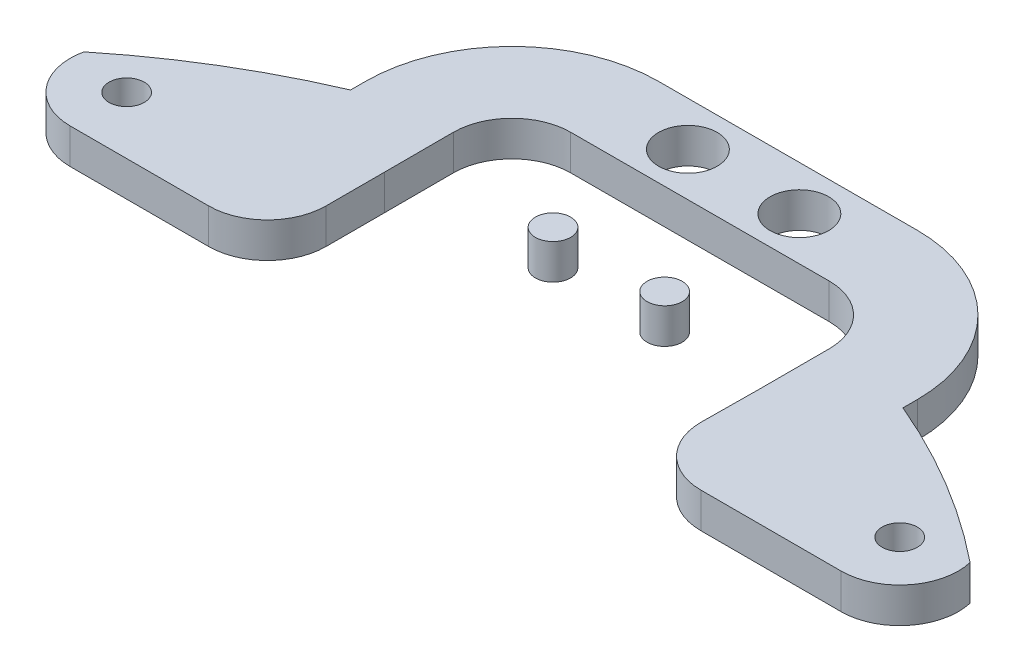
ISO-10303-21;
HEADER;
FILE_DESCRIPTION(('STEP AP214'),'2;1');
FILE_NAME('part.step','',(''),(''),'','','');
FILE_SCHEMA(('AUTOMOTIVE_DESIGN { 1 0 10303 214 1 1 1 1 }'));
ENDSEC;
DATA;
#1=APPLICATION_CONTEXT('core data for automotive mechanical design processes');
#2=APPLICATION_PROTOCOL_DEFINITION('international standard','automotive_design',2000,#1);
#3=PRODUCT_CONTEXT('',#1,'mechanical');
#4=PRODUCT('Part','Part','',(#3));
#5=PRODUCT_RELATED_PRODUCT_CATEGORY('part','',(#4));
#6=PRODUCT_DEFINITION_FORMATION('','',#4);
#7=PRODUCT_DEFINITION_CONTEXT('part definition',#1,'design');
#8=PRODUCT_DEFINITION('design','',#6,#7);
#9=PRODUCT_DEFINITION_SHAPE('','',#8);
#10=(LENGTH_UNIT() NAMED_UNIT(*) SI_UNIT(.MILLI.,.METRE.));
#11=(NAMED_UNIT(*) PLANE_ANGLE_UNIT() SI_UNIT($,.RADIAN.));
#12=(NAMED_UNIT(*) SI_UNIT($,.STERADIAN.) SOLID_ANGLE_UNIT());
#13=UNCERTAINTY_MEASURE_WITH_UNIT(LENGTH_MEASURE(1.E-05),#10,'distance_accuracy_value','');
#14=(GEOMETRIC_REPRESENTATION_CONTEXT(3) GLOBAL_UNCERTAINTY_ASSIGNED_CONTEXT((#13)) GLOBAL_UNIT_ASSIGNED_CONTEXT((#10,
#11,#12)) REPRESENTATION_CONTEXT('',''));
#15=CARTESIAN_POINT('',(0.,0.,0.));
#16=DIRECTION('',(0.,0.,1.));
#17=DIRECTION('',(1.,0.,0.));
#18=AXIS2_PLACEMENT_3D('',#15,#16,#17);
#19=CARTESIAN_POINT('',(66.2482415945255,3.,-8.11771555190945));
#20=DIRECTION('',(0.,-1.,0.));
#21=DIRECTION('',(0.,0.,-1.));
#22=AXIS2_PLACEMENT_3D('',#19,#20,#21);
#23=CYLINDRICAL_SURFACE('',#22,1.5);
#24=CARTESIAN_POINT('',(66.2482415945255,3.,-8.11771555190945));
#25=DIRECTION('',(0.,1.,0.));
#26=DIRECTION('',(0.,0.,1.));
#27=AXIS2_PLACEMENT_3D('',#24,#25,#26);
#28=CIRCLE('',#27,1.5);
#29=CARTESIAN_POINT('',(66.2482415945255,3.,-6.61771555190945));
#30=VERTEX_POINT('',#29);
#31=EDGE_CURVE('E11',#30,#30,#28,.T.);
#32=ORIENTED_EDGE('',*,*,#31,.F.);
#33=EDGE_LOOP('',(#32));
#34=FACE_BOUND('',#33,.T.);
#35=CARTESIAN_POINT('',(66.2482415945255,0.,-8.11771555190945));
#36=DIRECTION('',(0.,1.,0.));
#37=DIRECTION('',(0.,0.,1.));
#38=AXIS2_PLACEMENT_3D('',#35,#36,#37);
#39=CIRCLE('',#38,1.5);
#40=CARTESIAN_POINT('',(66.2482415945255,0.,-6.61771555190945));
#41=VERTEX_POINT('',#40);
#42=EDGE_CURVE('E43',#41,#41,#39,.T.);
#43=ORIENTED_EDGE('',*,*,#42,.T.);
#44=EDGE_LOOP('',(#43));
#45=FACE_BOUND('',#44,.T.);
#46=ADVANCED_FACE('F40',(#34,#45),#23,.T.);
#47=CARTESIAN_POINT('',(66.2482415945255,3.,-8.11771555190945));
#48=DIRECTION('',(0.,1.,0.));
#49=DIRECTION('',(0.,0.,1.));
#50=AXIS2_PLACEMENT_3D('',#47,#48,#49);
#51=PLANE('',#50);
#52=ORIENTED_EDGE('',*,*,#31,.T.);
#53=EDGE_LOOP('',(#52));
#54=FACE_BOUND('',#53,.T.);
#55=ADVANCED_FACE('F55',(#54),#51,.T.);
#56=CARTESIAN_POINT('',(66.2482415945255,0.,-8.11771555190945));
#57=DIRECTION('',(0.,1.,0.));
#58=DIRECTION('',(0.,0.,1.));
#59=AXIS2_PLACEMENT_3D('',#56,#57,#58);
#60=PLANE('',#59);
#61=ORIENTED_EDGE('',*,*,#42,.F.);
#62=EDGE_LOOP('',(#61));
#63=FACE_BOUND('',#62,.T.);
#64=ADVANCED_FACE('F53',(#63),#60,.F.);
#65=CLOSED_SHELL('',(#46,#55,#64));
#66=MANIFOLD_SOLID_BREP('B2',#65);
#67=CARTESIAN_POINT('',(56.7482546611768,3.,-8.10195908641783));
#68=DIRECTION('',(0.,-1.,0.));
#69=DIRECTION('',(0.,0.,-1.));
#70=AXIS2_PLACEMENT_3D('',#67,#68,#69);
#71=CYLINDRICAL_SURFACE('',#70,1.5);
#72=CARTESIAN_POINT('',(56.7482546611768,3.,-8.10195908641783));
#73=DIRECTION('',(0.,1.,0.));
#74=DIRECTION('',(0.,0.,1.));
#75=AXIS2_PLACEMENT_3D('',#72,#73,#74);
#76=CIRCLE('',#75,1.5);
#77=CARTESIAN_POINT('',(56.7482546611768,3.,-6.60195908641783));
#78=VERTEX_POINT('',#77);
#79=EDGE_CURVE('E39',#78,#78,#76,.T.);
#80=ORIENTED_EDGE('',*,*,#79,.F.);
#81=EDGE_LOOP('',(#80));
#82=FACE_BOUND('',#81,.T.);
#83=CARTESIAN_POINT('',(56.7482546611768,0.,-8.10195908641783));
#84=DIRECTION('',(0.,1.,0.));
#85=DIRECTION('',(0.,0.,1.));
#86=AXIS2_PLACEMENT_3D('',#83,#84,#85);
#87=CIRCLE('',#86,1.5);
#88=CARTESIAN_POINT('',(56.7482546611768,0.,-6.60195908641783));
#89=VERTEX_POINT('',#88);
#90=EDGE_CURVE('E93',#89,#89,#87,.T.);
#91=ORIENTED_EDGE('',*,*,#90,.T.);
#92=EDGE_LOOP('',(#91));
#93=FACE_BOUND('',#92,.T.);
#94=ADVANCED_FACE('F90',(#82,#93),#71,.T.);
#95=CARTESIAN_POINT('',(56.7482546611768,3.,-8.10195908641783));
#96=DIRECTION('',(0.,1.,0.));
#97=DIRECTION('',(0.,0.,1.));
#98=AXIS2_PLACEMENT_3D('',#95,#96,#97);
#99=PLANE('',#98);
#100=ORIENTED_EDGE('',*,*,#79,.T.);
#101=EDGE_LOOP('',(#100));
#102=FACE_BOUND('',#101,.T.);
#103=ADVANCED_FACE('F105',(#102),#99,.T.);
#104=CARTESIAN_POINT('',(56.7482546611768,0.,-8.10195908641783));
#105=DIRECTION('',(0.,1.,0.));
#106=DIRECTION('',(0.,0.,1.));
#107=AXIS2_PLACEMENT_3D('',#104,#105,#106);
#108=PLANE('',#107);
#109=ORIENTED_EDGE('',*,*,#90,.F.);
#110=EDGE_LOOP('',(#109));
#111=FACE_BOUND('',#110,.T.);
#112=ADVANCED_FACE('F103',(#111),#108,.F.);
#113=CLOSED_SHELL('',(#94,#103,#112));
#114=MANIFOLD_SOLID_BREP('B6',#113);
#115=CARTESIAN_POINT('',(94.4017441605242,3.,-5.09314812546791E-12));
#116=DIRECTION('',(0.,1.,0.));
#117=DIRECTION('',(0.,0.,1.));
#118=AXIS2_PLACEMENT_3D('',#115,#116,#117);
#119=PLANE('',#118);
#120=CARTESIAN_POINT('',(28.6197942043737,3.,0.109104468424916));
#121=DIRECTION('',(0.,1.,0.));
#122=DIRECTION('',(0.,0.,1.));
#123=AXIS2_PLACEMENT_3D('',#120,#121,#122);
#124=CIRCLE('',#123,1.5);
#125=CARTESIAN_POINT('',(28.6197942043737,3.,1.60910446842491));
#126=VERTEX_POINT('',#125);
#127=EDGE_CURVE('E493',#126,#126,#124,.T.);
#128=ORIENTED_EDGE('',*,*,#127,.F.);
#129=EDGE_LOOP('',(#128));
#130=FACE_BOUND('',#129,.T.);
#131=CARTESIAN_POINT('',(56.7482546611768,3.,-19.5997805691747));
#132=DIRECTION('',(0.,1.,0.));
#133=DIRECTION('',(0.,0.,1.));
#134=AXIS2_PLACEMENT_3D('',#131,#132,#133);
#135=CIRCLE('',#134,2.5);
#136=CARTESIAN_POINT('',(56.7482546611768,3.,-17.0997805691747));
#137=VERTEX_POINT('',#136);
#138=EDGE_CURVE('E304',#137,#137,#135,.T.);
#139=ORIENTED_EDGE('',*,*,#138,.F.);
#140=EDGE_LOOP('',(#139));
#141=FACE_BOUND('',#140,.T.);
#142=CARTESIAN_POINT('',(94.4017441605242,3.,-5.09314812546791E-12));
#143=DIRECTION('',(0.,1.,0.));
#144=DIRECTION('',(0.,0.,1.));
#145=AXIS2_PLACEMENT_3D('',#142,#143,#144);
#146=CIRCLE('',#145,5.00000000004039);
#147=CARTESIAN_POINT('',(94.4017441604865,3.,5.00000000003529));
#148=VERTEX_POINT('',#147);
#149=CARTESIAN_POINT('',(99.2740853669501,3.,-1.12262690533402));
#150=VERTEX_POINT('',#149);
#151=EDGE_CURVE('E339',#148,#150,#146,.T.);
#152=ORIENTED_EDGE('',*,*,#151,.T.);
#153=CARTESIAN_POINT('',(61.5872714696782,3.,45.5646739191136));
#154=DIRECTION('',(0.,1.,0.));
#155=DIRECTION('',(0.,0.,1.));
#156=AXIS2_PLACEMENT_3D('',#153,#154,#155);
#157=CIRCLE('',#156,60.0000000000006);
#158=CARTESIAN_POINT('',(84.9939370937053,3.,-9.68139385376106));
#159=VERTEX_POINT('',#158);
#160=EDGE_CURVE('E227',#150,#159,#157,.T.);
#161=ORIENTED_EDGE('',*,*,#160,.T.);
#162=DIRECTION('',(-0.000258123030673322,0.,-0.99999996668625));
#163=VECTOR('',#162,1.);
#164=CARTESIAN_POINT('',(84.9939370937054,3.,-9.68139385376104));
#165=LINE('',#164,#163);
#166=CARTESIAN_POINT('',(84.9936169760075,3.,-10.9215686894143));
#167=VERTEX_POINT('',#166);
#168=EDGE_CURVE('E390',#159,#167,#165,.T.);
#169=ORIENTED_EDGE('',*,*,#168,.T.);
#170=CARTESIAN_POINT('',(72.4936341689699,3.,-10.9008364979206));
#171=DIRECTION('',(0.,1.,0.));
#172=DIRECTION('',(0.,0.,1.));
#173=AXIS2_PLACEMENT_3D('',#170,#171,#172);
#174=CIRCLE('',#173,12.5);
#175=CARTESIAN_POINT('',(72.4729019775336,3.,-23.4008193049583));
#176=VERTEX_POINT('',#175);
#177=EDGE_CURVE('E409',#167,#176,#174,.T.);
#178=ORIENTED_EDGE('',*,*,#177,.T.);
#179=DIRECTION('',(-0.999998624563017,0.,0.0016585753149059));
#180=VECTOR('',#179,1.);
#181=CARTESIAN_POINT('',(72.4729019775336,3.,-23.4008193049583));
#182=LINE('',#181,#180);
#183=CARTESIAN_POINT('',(50.4729322371472,3.,-23.3643306480304));
#184=VERTEX_POINT('',#183);
#185=EDGE_CURVE('E406',#176,#184,#182,.T.);
#186=ORIENTED_EDGE('',*,*,#185,.T.);
#187=CARTESIAN_POINT('',(50.4936644285836,3.,-10.8643478409927));
#188=DIRECTION('',(0.,1.,0.));
#189=DIRECTION('',(0.,0.,1.));
#190=AXIS2_PLACEMENT_3D('',#187,#188,#189);
#191=CIRCLE('',#190,12.5);
#192=CARTESIAN_POINT('',(37.9936816215459,3.,-10.8436156495564));
#193=VERTEX_POINT('',#192);
#194=EDGE_CURVE('E408',#184,#193,#191,.T.);
#195=ORIENTED_EDGE('',*,*,#194,.T.);
#196=DIRECTION('',(0.000239441116848412,0.,0.999999971333975));
#197=VECTOR('',#196,1.);
#198=CARTESIAN_POINT('',(37.9936816215459,3.,-10.8436156495564));
#199=LINE('',#198,#197);
#200=CARTESIAN_POINT('',(37.9939789270336,3.,-9.60195138094567));
#201=VERTEX_POINT('',#200);
#202=EDGE_CURVE('E411',#193,#201,#199,.T.);
#203=ORIENTED_EDGE('',*,*,#202,.T.);
#204=CARTESIAN_POINT('',(61.5872714696782,3.,45.5646739191136));
#205=DIRECTION('',(0.,1.,0.));
#206=DIRECTION('',(0.,0.,1.));
#207=AXIS2_PLACEMENT_3D('',#204,#205,#206);
#208=CIRCLE('',#207,60.);
#209=CARTESIAN_POINT('',(23.8137806106933,3.,-1.05252664383504));
#210=VERTEX_POINT('',#209);
#211=EDGE_CURVE('E417',#201,#210,#208,.T.);
#212=ORIENTED_EDGE('',*,*,#211,.T.);
#213=CARTESIAN_POINT('',(28.7017441604768,3.,0.));
#214=DIRECTION('',(0.,1.,0.));
#215=DIRECTION('',(0.,0.,1.));
#216=AXIS2_PLACEMENT_3D('',#213,#214,#215);
#217=CIRCLE('',#216,4.99999999999993);
#218=CARTESIAN_POINT('',(28.7017441604768,3.,4.99999999999994));
#219=VERTEX_POINT('',#218);
#220=EDGE_CURVE('E419',#210,#219,#217,.T.);
#221=ORIENTED_EDGE('',*,*,#220,.T.);
#222=DIRECTION('',(1.,0.,5.37101593738761E-13));
#223=VECTOR('',#222,1.);
#224=CARTESIAN_POINT('',(40.5033840273318,3.,5.00000000000635));
#225=LINE('',#224,#223);
#226=CARTESIAN_POINT('',(40.5033840273318,3.,5.00000000000635));
#227=VERTEX_POINT('',#226);
#228=EDGE_CURVE('E421',#219,#227,#225,.T.);
#229=ORIENTED_EDGE('',*,*,#228,.T.);
#230=CARTESIAN_POINT('',(40.5033840273344,3.,6.34648583686501E-12));
#231=DIRECTION('',(0.,1.,0.));
#232=DIRECTION('',(0.,0.,-1.));
#233=AXIS2_PLACEMENT_3D('',#230,#231,#232);
#234=CIRCLE('',#233,5.);
#235=CARTESIAN_POINT('',(45.5033840273344,3.,6.34617967516522E-12));
#236=VERTEX_POINT('',#235);
#237=EDGE_CURVE('E423',#227,#236,#234,.T.);
#238=ORIENTED_EDGE('',*,*,#237,.T.);
#239=DIRECTION('',(0.,0.,-1.));
#240=VECTOR('',#239,1.);
#241=CARTESIAN_POINT('',(45.5033840273344,3.,-5.00000000000017));
#242=LINE('',#241,#240);
#243=CARTESIAN_POINT('',(45.5033840273344,3.,-5.00000000000017));
#244=VERTEX_POINT('',#243);
#245=EDGE_CURVE('E425',#236,#244,#242,.T.);
#246=ORIENTED_EDGE('',*,*,#245,.T.);
#247=DIRECTION('',(-0.00165857531490633,0.,-0.999998624563016));
#248=VECTOR('',#247,1.);
#249=CARTESIAN_POINT('',(45.4936713057685,3.,-10.8560549644182));
#250=LINE('',#249,#248);
#251=CARTESIAN_POINT('',(45.4936713057685,3.,-10.8560549644182));
#252=VERTEX_POINT('',#251);
#253=EDGE_CURVE('E427',#244,#252,#250,.T.);
#254=ORIENTED_EDGE('',*,*,#253,.T.);
#255=CARTESIAN_POINT('',(50.4936644285836,3.,-10.8643478409927));
#256=DIRECTION('',(0.,-1.,0.));
#257=DIRECTION('',(0.,0.,1.));
#258=AXIS2_PLACEMENT_3D('',#255,#256,#257);
#259=CIRCLE('',#258,5.);
#260=CARTESIAN_POINT('',(50.485371552009,3.,-15.8643409638078));
#261=VERTEX_POINT('',#260);
#262=EDGE_CURVE('E429',#252,#261,#259,.T.);
#263=ORIENTED_EDGE('',*,*,#262,.T.);
#264=DIRECTION('',(0.999998624563017,0.,-0.00165857531490606));
#265=VECTOR('',#264,1.);
#266=CARTESIAN_POINT('',(72.4853412923954,3.,-15.9008296207357));
#267=LINE('',#266,#265);
#268=CARTESIAN_POINT('',(72.4853412923954,3.,-15.9008296207357));
#269=VERTEX_POINT('',#268);
#270=EDGE_CURVE('E431',#261,#269,#267,.T.);
#271=ORIENTED_EDGE('',*,*,#270,.T.);
#272=CARTESIAN_POINT('',(72.4936341689699,3.,-10.9008364979206));
#273=DIRECTION('',(0.,-1.,0.));
#274=DIRECTION('',(0.,0.,1.));
#275=AXIS2_PLACEMENT_3D('',#272,#273,#274);
#276=CIRCLE('',#275,4.99999999999999);
#277=CARTESIAN_POINT('',(77.493627291785,3.,-10.9091293744952));
#278=VERTEX_POINT('',#277);
#279=EDGE_CURVE('E433',#269,#278,#276,.T.);
#280=ORIENTED_EDGE('',*,*,#279,.T.);
#281=DIRECTION('',(0.000255174911125051,0.,0.999999967442882));
#282=VECTOR('',#281,1.);
#283=CARTESIAN_POINT('',(77.4951351533971,3.,-4.99999999999046));
#284=LINE('',#283,#282);
#285=CARTESIAN_POINT('',(77.4951351533971,3.,-4.99999999999046));
#286=VERTEX_POINT('',#285);
#287=EDGE_CURVE('E282',#278,#286,#284,.T.);
#288=ORIENTED_EDGE('',*,*,#287,.T.);
#289=DIRECTION('',(-0.00912026694199644,0.,0.999958409500569));
#290=VECTOR('',#289,1.);
#291=CARTESIAN_POINT('',(77.4951351533971,3.,-4.99999999999046));
#292=LINE('',#291,#290);
#293=CARTESIAN_POINT('',(77.4499478356693,3.,-0.045601334681104));
#294=VERTEX_POINT('',#293);
#295=EDGE_CURVE('E276',#286,#294,#292,.T.);
#296=ORIENTED_EDGE('',*,*,#295,.T.);
#297=CARTESIAN_POINT('',(82.4497398831721,3.,2.88744798835198E-11));
#298=DIRECTION('',(0.,1.,0.));
#299=DIRECTION('',(0.,0.,-1.));
#300=AXIS2_PLACEMENT_3D('',#297,#298,#299);
#301=CIRCLE('',#300,5.);
#302=CARTESIAN_POINT('',(82.4497398831694,3.,5.00000000002888));
#303=VERTEX_POINT('',#302);
#304=EDGE_CURVE('E280',#294,#303,#301,.T.);
#305=ORIENTED_EDGE('',*,*,#304,.T.);
#306=DIRECTION('',(1.,0.,5.3694839379833E-13));
#307=VECTOR('',#306,1.);
#308=CARTESIAN_POINT('',(94.4017441604865,3.,5.00000000003529));
#309=LINE('',#308,#307);
#310=EDGE_CURVE('E148',#303,#148,#309,.T.);
#311=ORIENTED_EDGE('',*,*,#310,.T.);
#312=EDGE_LOOP('',(#152,#161,#169,#178,#186,#195,#203,#212,#221,#229,#238,#246,#254,#263,#271,
#280,#288,#296,#305,#311));
#313=FACE_BOUND('',#312,.T.);
#314=CARTESIAN_POINT('',(66.2482415945255,3.,-19.5997805691747));
#315=DIRECTION('',(0.,1.,0.));
#316=DIRECTION('',(0.,0.,1.));
#317=AXIS2_PLACEMENT_3D('',#314,#315,#316);
#318=CIRCLE('',#317,2.50000000000001);
#319=CARTESIAN_POINT('',(66.2482415945255,3.,-17.0997805691747));
#320=VERTEX_POINT('',#319);
#321=EDGE_CURVE('E499',#320,#320,#318,.T.);
#322=ORIENTED_EDGE('',*,*,#321,.F.);
#323=EDGE_LOOP('',(#322));
#324=FACE_BOUND('',#323,.T.);
#325=CARTESIAN_POINT('',(94.4017441605242,3.,-5.09314812546791E-12));
#326=DIRECTION('',(0.,1.,0.));
#327=DIRECTION('',(0.,0.,1.));
#328=AXIS2_PLACEMENT_3D('',#325,#326,#327);
#329=CIRCLE('',#328,1.5);
#330=CARTESIAN_POINT('',(94.4017441605242,3.,1.4999999999949));
#331=VERTEX_POINT('',#330);
#332=EDGE_CURVE('E484',#331,#331,#329,.T.);
#333=ORIENTED_EDGE('',*,*,#332,.F.);
#334=EDGE_LOOP('',(#333));
#335=FACE_BOUND('',#334,.T.);
#336=ADVANCED_FACE('F131',(#130,#141,#313,#324,#335),#119,.T.);
#337=CARTESIAN_POINT('',(94.4017441605242,0.,-5.09314812546791E-12));
#338=DIRECTION('',(0.,1.,0.));
#339=DIRECTION('',(0.,0.,1.));
#340=AXIS2_PLACEMENT_3D('',#337,#338,#339);
#341=PLANE('',#340);
#342=CARTESIAN_POINT('',(94.4017441605242,0.,-5.09314812546791E-12));
#343=DIRECTION('',(0.,1.,0.));
#344=DIRECTION('',(0.,0.,1.));
#345=AXIS2_PLACEMENT_3D('',#342,#343,#344);
#346=CIRCLE('',#345,5.00000000004039);
#347=CARTESIAN_POINT('',(94.4017441604865,0.,5.00000000003529));
#348=VERTEX_POINT('',#347);
#349=CARTESIAN_POINT('',(99.2740853669501,0.,-1.12262690533402));
#350=VERTEX_POINT('',#349);
#351=EDGE_CURVE('E300',#348,#350,#346,.T.);
#352=ORIENTED_EDGE('',*,*,#351,.F.);
#353=DIRECTION('',(1.,0.,5.3694839379833E-13));
#354=VECTOR('',#353,1.);
#355=CARTESIAN_POINT('',(94.4017441604865,0.,5.00000000003529));
#356=LINE('',#355,#354);
#357=CARTESIAN_POINT('',(82.4497398831694,0.,5.00000000002888));
#358=VERTEX_POINT('',#357);
#359=EDGE_CURVE('E219',#358,#348,#356,.T.);
#360=ORIENTED_EDGE('',*,*,#359,.F.);
#361=CARTESIAN_POINT('',(82.4497398831721,0.,2.88744798835198E-11));
#362=DIRECTION('',(0.,1.,0.));
#363=DIRECTION('',(0.,0.,-1.));
#364=AXIS2_PLACEMENT_3D('',#361,#362,#363);
#365=CIRCLE('',#364,5.);
#366=CARTESIAN_POINT('',(77.4499478356693,0.,-0.045601334681104));
#367=VERTEX_POINT('',#366);
#368=EDGE_CURVE('E213',#367,#358,#365,.T.);
#369=ORIENTED_EDGE('',*,*,#368,.F.);
#370=DIRECTION('',(-0.00912026694199644,0.,0.999958409500569));
#371=VECTOR('',#370,1.);
#372=CARTESIAN_POINT('',(77.4951351533971,0.,-4.99999999999046));
#373=LINE('',#372,#371);
#374=CARTESIAN_POINT('',(77.4951351533971,0.,-4.99999999999046));
#375=VERTEX_POINT('',#374);
#376=EDGE_CURVE('E290',#375,#367,#373,.T.);
#377=ORIENTED_EDGE('',*,*,#376,.F.);
#378=DIRECTION('',(0.000255174911125051,0.,0.999999967442882));
#379=VECTOR('',#378,1.);
#380=CARTESIAN_POINT('',(77.4951351533971,0.,-4.99999999999046));
#381=LINE('',#380,#379);
#382=CARTESIAN_POINT('',(77.493627291785,0.,-10.9091293744952));
#383=VERTEX_POINT('',#382);
#384=EDGE_CURVE('E334',#383,#375,#381,.T.);
#385=ORIENTED_EDGE('',*,*,#384,.F.);
#386=CARTESIAN_POINT('',(72.4936341689699,0.,-10.9008364979206));
#387=DIRECTION('',(0.,-1.,0.));
#388=DIRECTION('',(0.,0.,1.));
#389=AXIS2_PLACEMENT_3D('',#386,#387,#388);
#390=CIRCLE('',#389,4.99999999999999);
#391=CARTESIAN_POINT('',(72.4853412923954,0.,-15.9008296207357));
#392=VERTEX_POINT('',#391);
#393=EDGE_CURVE('E332',#392,#383,#390,.T.);
#394=ORIENTED_EDGE('',*,*,#393,.F.);
#395=DIRECTION('',(0.999998624563017,0.,-0.00165857531490606));
#396=VECTOR('',#395,1.);
#397=CARTESIAN_POINT('',(72.4853412923954,0.,-15.9008296207357));
#398=LINE('',#397,#396);
#399=CARTESIAN_POINT('',(50.485371552009,0.,-15.8643409638078));
#400=VERTEX_POINT('',#399);
#401=EDGE_CURVE('E330',#400,#392,#398,.T.);
#402=ORIENTED_EDGE('',*,*,#401,.F.);
#403=CARTESIAN_POINT('',(50.4936644285836,0.,-10.8643478409927));
#404=DIRECTION('',(0.,-1.,0.));
#405=DIRECTION('',(0.,0.,1.));
#406=AXIS2_PLACEMENT_3D('',#403,#404,#405);
#407=CIRCLE('',#406,5.);
#408=CARTESIAN_POINT('',(45.4936713057685,0.,-10.8560549644182));
#409=VERTEX_POINT('',#408);
#410=EDGE_CURVE('E328',#409,#400,#407,.T.);
#411=ORIENTED_EDGE('',*,*,#410,.F.);
#412=DIRECTION('',(-0.00165857531490633,0.,-0.999998624563016));
#413=VECTOR('',#412,1.);
#414=CARTESIAN_POINT('',(45.4936713057685,0.,-10.8560549644182));
#415=LINE('',#414,#413);
#416=CARTESIAN_POINT('',(45.5033840273344,0.,-5.00000000000017));
#417=VERTEX_POINT('',#416);
#418=EDGE_CURVE('E326',#417,#409,#415,.T.);
#419=ORIENTED_EDGE('',*,*,#418,.F.);
#420=DIRECTION('',(0.,0.,-1.));
#421=VECTOR('',#420,1.);
#422=CARTESIAN_POINT('',(45.5033840273344,0.,-5.00000000000017));
#423=LINE('',#422,#421);
#424=CARTESIAN_POINT('',(45.5033840273344,0.,6.34617967516522E-12));
#425=VERTEX_POINT('',#424);
#426=EDGE_CURVE('E324',#425,#417,#423,.T.);
#427=ORIENTED_EDGE('',*,*,#426,.F.);
#428=CARTESIAN_POINT('',(40.5033840273344,0.,6.34648583686501E-12));
#429=DIRECTION('',(0.,1.,0.));
#430=DIRECTION('',(0.,0.,-1.));
#431=AXIS2_PLACEMENT_3D('',#428,#429,#430);
#432=CIRCLE('',#431,5.);
#433=CARTESIAN_POINT('',(40.5033840273318,0.,5.00000000000635));
#434=VERTEX_POINT('',#433);
#435=EDGE_CURVE('E322',#434,#425,#432,.T.);
#436=ORIENTED_EDGE('',*,*,#435,.F.);
#437=DIRECTION('',(1.,0.,5.37101593738761E-13));
#438=VECTOR('',#437,1.);
#439=CARTESIAN_POINT('',(40.5033840273318,0.,5.00000000000635));
#440=LINE('',#439,#438);
#441=CARTESIAN_POINT('',(28.7017441604768,0.,4.99999999999994));
#442=VERTEX_POINT('',#441);
#443=EDGE_CURVE('E320',#442,#434,#440,.T.);
#444=ORIENTED_EDGE('',*,*,#443,.F.);
#445=CARTESIAN_POINT('',(28.7017441604768,0.,0.));
#446=DIRECTION('',(0.,1.,0.));
#447=DIRECTION('',(0.,0.,1.));
#448=AXIS2_PLACEMENT_3D('',#445,#446,#447);
#449=CIRCLE('',#448,4.99999999999993);
#450=CARTESIAN_POINT('',(23.8137806106933,0.,-1.05252664383504));
#451=VERTEX_POINT('',#450);
#452=EDGE_CURVE('E318',#451,#442,#449,.T.);
#453=ORIENTED_EDGE('',*,*,#452,.F.);
#454=CARTESIAN_POINT('',(61.5872714696782,0.,45.5646739191136));
#455=DIRECTION('',(0.,1.,0.));
#456=DIRECTION('',(0.,0.,1.));
#457=AXIS2_PLACEMENT_3D('',#454,#455,#456);
#458=CIRCLE('',#457,60.);
#459=CARTESIAN_POINT('',(37.9939789270336,0.,-9.60195138094567));
#460=VERTEX_POINT('',#459);
#461=EDGE_CURVE('E316',#460,#451,#458,.T.);
#462=ORIENTED_EDGE('',*,*,#461,.F.);
#463=DIRECTION('',(0.000239441116848412,0.,0.999999971333975));
#464=VECTOR('',#463,1.);
#465=CARTESIAN_POINT('',(37.9936816215459,0.,-10.8436156495564));
#466=LINE('',#465,#464);
#467=CARTESIAN_POINT('',(37.9936816215459,0.,-10.8436156495564));
#468=VERTEX_POINT('',#467);
#469=EDGE_CURVE('E314',#468,#460,#466,.T.);
#470=ORIENTED_EDGE('',*,*,#469,.F.);
#471=CARTESIAN_POINT('',(50.4936644285836,0.,-10.8643478409927));
#472=DIRECTION('',(0.,1.,0.));
#473=DIRECTION('',(0.,0.,1.));
#474=AXIS2_PLACEMENT_3D('',#471,#472,#473);
#475=CIRCLE('',#474,12.5);
#476=CARTESIAN_POINT('',(50.4729322371472,0.,-23.3643306480304));
#477=VERTEX_POINT('',#476);
#478=EDGE_CURVE('E312',#477,#468,#475,.T.);
#479=ORIENTED_EDGE('',*,*,#478,.F.);
#480=DIRECTION('',(-0.999998624563017,0.,0.0016585753149059));
#481=VECTOR('',#480,1.);
#482=CARTESIAN_POINT('',(72.4729019775336,0.,-23.4008193049583));
#483=LINE('',#482,#481);
#484=CARTESIAN_POINT('',(72.4729019775336,0.,-23.4008193049583));
#485=VERTEX_POINT('',#484);
#486=EDGE_CURVE('E310',#485,#477,#483,.T.);
#487=ORIENTED_EDGE('',*,*,#486,.F.);
#488=CARTESIAN_POINT('',(72.4936341689699,0.,-10.9008364979206));
#489=DIRECTION('',(0.,1.,0.));
#490=DIRECTION('',(0.,0.,1.));
#491=AXIS2_PLACEMENT_3D('',#488,#489,#490);
#492=CIRCLE('',#491,12.5);
#493=CARTESIAN_POINT('',(84.9936169760075,0.,-10.9215686894143));
#494=VERTEX_POINT('',#493);
#495=EDGE_CURVE('E308',#494,#485,#492,.T.);
#496=ORIENTED_EDGE('',*,*,#495,.F.);
#497=DIRECTION('',(-0.000258123030673322,0.,-0.99999996668625));
#498=VECTOR('',#497,1.);
#499=CARTESIAN_POINT('',(84.9939370937054,0.,-9.68139385376104));
#500=LINE('',#499,#498);
#501=CARTESIAN_POINT('',(84.9939370937053,0.,-9.68139385376106));
#502=VERTEX_POINT('',#501);
#503=EDGE_CURVE('E306',#502,#494,#500,.T.);
#504=ORIENTED_EDGE('',*,*,#503,.F.);
#505=CARTESIAN_POINT('',(61.5872714696782,0.,45.5646739191136));
#506=DIRECTION('',(0.,1.,0.));
#507=DIRECTION('',(0.,0.,1.));
#508=AXIS2_PLACEMENT_3D('',#505,#506,#507);
#509=CIRCLE('',#508,60.0000000000006);
#510=EDGE_CURVE('E303',#350,#502,#509,.T.);
#511=ORIENTED_EDGE('',*,*,#510,.F.);
#512=EDGE_LOOP('',(#352,#360,#369,#377,#385,#394,#402,#411,#419,#427,#436,#444,#453,#462,#470,
#479,#487,#496,#504,#511));
#513=FACE_BOUND('',#512,.T.);
#514=CARTESIAN_POINT('',(56.7482546611768,0.,-19.5997805691747));
#515=DIRECTION('',(0.,1.,0.));
#516=DIRECTION('',(0.,0.,1.));
#517=AXIS2_PLACEMENT_3D('',#514,#515,#516);
#518=CIRCLE('',#517,2.5);
#519=CARTESIAN_POINT('',(56.7482546611768,0.,-17.0997805691747));
#520=VERTEX_POINT('',#519);
#521=EDGE_CURVE('E502',#520,#520,#518,.T.);
#522=ORIENTED_EDGE('',*,*,#521,.T.);
#523=EDGE_LOOP('',(#522));
#524=FACE_BOUND('',#523,.T.);
#525=CARTESIAN_POINT('',(66.2482415945255,0.,-19.5997805691747));
#526=DIRECTION('',(0.,1.,0.));
#527=DIRECTION('',(0.,0.,1.));
#528=AXIS2_PLACEMENT_3D('',#525,#526,#527);
#529=CIRCLE('',#528,2.50000000000001);
#530=CARTESIAN_POINT('',(66.2482415945255,0.,-17.0997805691747));
#531=VERTEX_POINT('',#530);
#532=EDGE_CURVE('E496',#531,#531,#529,.T.);
#533=ORIENTED_EDGE('',*,*,#532,.T.);
#534=EDGE_LOOP('',(#533));
#535=FACE_BOUND('',#534,.T.);
#536=CARTESIAN_POINT('',(28.6197942043737,0.,0.109104468424916));
#537=DIRECTION('',(0.,1.,0.));
#538=DIRECTION('',(0.,0.,1.));
#539=AXIS2_PLACEMENT_3D('',#536,#537,#538);
#540=CIRCLE('',#539,1.5);
#541=CARTESIAN_POINT('',(28.6197942043737,0.,1.60910446842491));
#542=VERTEX_POINT('',#541);
#543=EDGE_CURVE('E490',#542,#542,#540,.T.);
#544=ORIENTED_EDGE('',*,*,#543,.T.);
#545=EDGE_LOOP('',(#544));
#546=FACE_BOUND('',#545,.T.);
#547=CARTESIAN_POINT('',(94.4017441605242,0.,-5.09314812546791E-12));
#548=DIRECTION('',(0.,1.,0.));
#549=DIRECTION('',(0.,0.,1.));
#550=AXIS2_PLACEMENT_3D('',#547,#548,#549);
#551=CIRCLE('',#550,1.5);
#552=CARTESIAN_POINT('',(94.4017441605242,0.,1.4999999999949));
#553=VERTEX_POINT('',#552);
#554=EDGE_CURVE('E487',#553,#553,#551,.T.);
#555=ORIENTED_EDGE('',*,*,#554,.T.);
#556=EDGE_LOOP('',(#555));
#557=FACE_BOUND('',#556,.T.);
#558=ADVANCED_FACE('F394',(#513,#524,#535,#546,#557),#341,.F.);
#559=CARTESIAN_POINT('',(94.4017441605242,3.,-5.09314812546791E-12));
#560=DIRECTION('',(0.,-1.,0.));
#561=DIRECTION('',(0.,0.,-1.));
#562=AXIS2_PLACEMENT_3D('',#559,#560,#561);
#563=CYLINDRICAL_SURFACE('',#562,5.00000000004039);
#564=ORIENTED_EDGE('',*,*,#351,.T.);
#565=DIRECTION('',(0.,-1.,0.));
#566=VECTOR('',#565,1.);
#567=CARTESIAN_POINT('',(99.2740853669501,3.,-1.12262690533402));
#568=LINE('',#567,#566);
#569=EDGE_CURVE('E88',#150,#350,#568,.T.);
#570=ORIENTED_EDGE('',*,*,#569,.F.);
#571=ORIENTED_EDGE('',*,*,#151,.F.);
#572=DIRECTION('',(0.,-1.,0.));
#573=VECTOR('',#572,1.);
#574=CARTESIAN_POINT('',(94.4017441604865,3.,5.00000000003529));
#575=LINE('',#574,#573);
#576=EDGE_CURVE('E296',#148,#348,#575,.T.);
#577=ORIENTED_EDGE('',*,*,#576,.T.);
#578=EDGE_LOOP('',(#564,#570,#571,#577));
#579=FACE_BOUND('',#578,.T.);
#580=ADVANCED_FACE('F133',(#579),#563,.T.);
#581=CARTESIAN_POINT('',(61.5872714696782,3.,45.5646739191136));
#582=DIRECTION('',(0.,-1.,0.));
#583=DIRECTION('',(0.,0.,-1.));
#584=AXIS2_PLACEMENT_3D('',#581,#582,#583);
#585=CYLINDRICAL_SURFACE('',#584,60.0000000000006);
#586=ORIENTED_EDGE('',*,*,#510,.T.);
#587=DIRECTION('',(0.,-1.,0.));
#588=VECTOR('',#587,1.);
#589=CARTESIAN_POINT('',(84.9939370937053,3.,-9.68139385376106));
#590=LINE('',#589,#588);
#591=EDGE_CURVE('E140',#159,#502,#590,.T.);
#592=ORIENTED_EDGE('',*,*,#591,.F.);
#593=ORIENTED_EDGE('',*,*,#160,.F.);
#594=ORIENTED_EDGE('',*,*,#569,.T.);
#595=EDGE_LOOP('',(#586,#592,#593,#594));
#596=FACE_BOUND('',#595,.T.);
#597=ADVANCED_FACE('F692',(#596),#585,.T.);
#598=CARTESIAN_POINT('',(84.9939370937054,3.,-9.68139385376104));
#599=DIRECTION('',(-0.99999996668625,0.,0.000258123030673322));
#600=DIRECTION('',(0.000258123030673322,0.,0.99999996668625));
#601=AXIS2_PLACEMENT_3D('',#598,#599,#600);
#602=PLANE('',#601);
#603=ORIENTED_EDGE('',*,*,#503,.T.);
#604=DIRECTION('',(0.,-1.,0.));
#605=VECTOR('',#604,1.);
#606=CARTESIAN_POINT('',(84.9936169760075,3.,-10.9215686894143));
#607=LINE('',#606,#605);
#608=EDGE_CURVE('E382',#167,#494,#607,.T.);
#609=ORIENTED_EDGE('',*,*,#608,.F.);
#610=ORIENTED_EDGE('',*,*,#168,.F.);
#611=ORIENTED_EDGE('',*,*,#591,.T.);
#612=EDGE_LOOP('',(#603,#609,#610,#611));
#613=FACE_BOUND('',#612,.T.);
#614=ADVANCED_FACE('F388',(#613),#602,.F.);
#615=CARTESIAN_POINT('',(72.4936341689699,3.,-10.9008364979206));
#616=DIRECTION('',(0.,-1.,0.));
#617=DIRECTION('',(0.,0.,-1.));
#618=AXIS2_PLACEMENT_3D('',#615,#616,#617);
#619=CYLINDRICAL_SURFACE('',#618,12.5);
#620=ORIENTED_EDGE('',*,*,#495,.T.);
#621=DIRECTION('',(0.,-1.,0.));
#622=VECTOR('',#621,1.);
#623=CARTESIAN_POINT('',(72.4729019775336,3.,-23.4008193049583));
#624=LINE('',#623,#622);
#625=EDGE_CURVE('E379',#176,#485,#624,.T.);
#626=ORIENTED_EDGE('',*,*,#625,.F.);
#627=ORIENTED_EDGE('',*,*,#177,.F.);
#628=ORIENTED_EDGE('',*,*,#608,.T.);
#629=EDGE_LOOP('',(#620,#626,#627,#628));
#630=FACE_BOUND('',#629,.T.);
#631=ADVANCED_FACE('F400',(#630),#619,.T.);
#632=CARTESIAN_POINT('',(72.4729019775336,3.,-23.4008193049583));
#633=DIRECTION('',(0.0016585753149059,0.,0.999998624563016));
#634=DIRECTION('',(0.999998624563016,0.,-0.0016585753149059));
#635=AXIS2_PLACEMENT_3D('',#632,#633,#634);
#636=PLANE('',#635);
#637=ORIENTED_EDGE('',*,*,#486,.T.);
#638=DIRECTION('',(0.,-1.,0.));
#639=VECTOR('',#638,1.);
#640=CARTESIAN_POINT('',(50.4729322371472,3.,-23.3643306480304));
#641=LINE('',#640,#639);
#642=EDGE_CURVE('E376',#184,#477,#641,.T.);
#643=ORIENTED_EDGE('',*,*,#642,.F.);
#644=ORIENTED_EDGE('',*,*,#185,.F.);
#645=ORIENTED_EDGE('',*,*,#625,.T.);
#646=EDGE_LOOP('',(#637,#643,#644,#645));
#647=FACE_BOUND('',#646,.T.);
#648=ADVANCED_FACE('F404',(#647),#636,.F.);
#649=CARTESIAN_POINT('',(50.4936644285836,3.,-10.8643478409927));
#650=DIRECTION('',(0.,-1.,0.));
#651=DIRECTION('',(0.,0.,-1.));
#652=AXIS2_PLACEMENT_3D('',#649,#650,#651);
#653=CYLINDRICAL_SURFACE('',#652,12.5);
#654=ORIENTED_EDGE('',*,*,#478,.T.);
#655=DIRECTION('',(0.,-1.,0.));
#656=VECTOR('',#655,1.);
#657=CARTESIAN_POINT('',(37.9936816215459,3.,-10.8436156495564));
#658=LINE('',#657,#656);
#659=EDGE_CURVE('E373',#193,#468,#658,.T.);
#660=ORIENTED_EDGE('',*,*,#659,.F.);
#661=ORIENTED_EDGE('',*,*,#194,.F.);
#662=ORIENTED_EDGE('',*,*,#642,.T.);
#663=EDGE_LOOP('',(#654,#660,#661,#662));
#664=FACE_BOUND('',#663,.T.);
#665=ADVANCED_FACE('F657',(#664),#653,.T.);
#666=CARTESIAN_POINT('',(37.9936816215459,3.,-10.8436156495564));
#667=DIRECTION('',(0.999999971333975,0.,-0.000239441116848412));
#668=DIRECTION('',(-0.000239441116848412,0.,-0.999999971333975));
#669=AXIS2_PLACEMENT_3D('',#666,#667,#668);
#670=PLANE('',#669);
#671=ORIENTED_EDGE('',*,*,#469,.T.);
#672=DIRECTION('',(0.,-1.,0.));
#673=VECTOR('',#672,1.);
#674=CARTESIAN_POINT('',(37.9939789270336,3.,-9.60195138094567));
#675=LINE('',#674,#673);
#676=EDGE_CURVE('E370',#201,#460,#675,.T.);
#677=ORIENTED_EDGE('',*,*,#676,.F.);
#678=ORIENTED_EDGE('',*,*,#202,.F.);
#679=ORIENTED_EDGE('',*,*,#659,.T.);
#680=EDGE_LOOP('',(#671,#677,#678,#679));
#681=FACE_BOUND('',#680,.T.);
#682=ADVANCED_FACE('F647',(#681),#670,.F.);
#683=CARTESIAN_POINT('',(61.5872714696782,3.,45.5646739191136));
#684=DIRECTION('',(0.,-1.,0.));
#685=DIRECTION('',(0.,0.,-1.));
#686=AXIS2_PLACEMENT_3D('',#683,#684,#685);
#687=CYLINDRICAL_SURFACE('',#686,60.);
#688=ORIENTED_EDGE('',*,*,#461,.T.);
#689=DIRECTION('',(0.,-1.,0.));
#690=VECTOR('',#689,1.);
#691=CARTESIAN_POINT('',(23.8137806106933,3.,-1.05252664383504));
#692=LINE('',#691,#690);
#693=EDGE_CURVE('E367',#210,#451,#692,.T.);
#694=ORIENTED_EDGE('',*,*,#693,.F.);
#695=ORIENTED_EDGE('',*,*,#211,.F.);
#696=ORIENTED_EDGE('',*,*,#676,.T.);
#697=EDGE_LOOP('',(#688,#694,#695,#696));
#698=FACE_BOUND('',#697,.T.);
#699=ADVANCED_FACE('F637',(#698),#687,.T.);
#700=CARTESIAN_POINT('',(28.7017441604768,3.,0.));
#701=DIRECTION('',(0.,-1.,0.));
#702=DIRECTION('',(0.,0.,-1.));
#703=AXIS2_PLACEMENT_3D('',#700,#701,#702);
#704=CYLINDRICAL_SURFACE('',#703,4.99999999999993);
#705=ORIENTED_EDGE('',*,*,#452,.T.);
#706=DIRECTION('',(0.,-1.,0.));
#707=VECTOR('',#706,1.);
#708=CARTESIAN_POINT('',(28.7017441604768,3.,4.99999999999994));
#709=LINE('',#708,#707);
#710=EDGE_CURVE('E364',#219,#442,#709,.T.);
#711=ORIENTED_EDGE('',*,*,#710,.F.);
#712=ORIENTED_EDGE('',*,*,#220,.F.);
#713=ORIENTED_EDGE('',*,*,#693,.T.);
#714=EDGE_LOOP('',(#705,#711,#712,#713));
#715=FACE_BOUND('',#714,.T.);
#716=ADVANCED_FACE('F627',(#715),#704,.T.);
#717=CARTESIAN_POINT('',(40.5033840273318,3.,5.00000000000635));
#718=DIRECTION('',(5.37101593738761E-13,0.,-1.));
#719=DIRECTION('',(-1.,0.,-5.37101593738761E-13));
#720=AXIS2_PLACEMENT_3D('',#717,#718,#719);
#721=PLANE('',#720);
#722=ORIENTED_EDGE('',*,*,#443,.T.);
#723=DIRECTION('',(0.,-1.,0.));
#724=VECTOR('',#723,1.);
#725=CARTESIAN_POINT('',(40.5033840273318,3.,5.00000000000635));
#726=LINE('',#725,#724);
#727=EDGE_CURVE('E361',#227,#434,#726,.T.);
#728=ORIENTED_EDGE('',*,*,#727,.F.);
#729=ORIENTED_EDGE('',*,*,#228,.F.);
#730=ORIENTED_EDGE('',*,*,#710,.T.);
#731=EDGE_LOOP('',(#722,#728,#729,#730));
#732=FACE_BOUND('',#731,.T.);
#733=ADVANCED_FACE('F617',(#732),#721,.F.);
#734=CARTESIAN_POINT('',(40.5033840273344,3.,6.34648583686501E-12));
#735=DIRECTION('',(0.,-1.,0.));
#736=DIRECTION('',(0.,0.,-1.));
#737=AXIS2_PLACEMENT_3D('',#734,#735,#736);
#738=CYLINDRICAL_SURFACE('',#737,5.);
#739=ORIENTED_EDGE('',*,*,#435,.T.);
#740=DIRECTION('',(0.,-1.,0.));
#741=VECTOR('',#740,1.);
#742=CARTESIAN_POINT('',(45.5033840273344,3.,6.34617967516522E-12));
#743=LINE('',#742,#741);
#744=EDGE_CURVE('E358',#236,#425,#743,.T.);
#745=ORIENTED_EDGE('',*,*,#744,.F.);
#746=ORIENTED_EDGE('',*,*,#237,.F.);
#747=ORIENTED_EDGE('',*,*,#727,.T.);
#748=EDGE_LOOP('',(#739,#745,#746,#747));
#749=FACE_BOUND('',#748,.T.);
#750=ADVANCED_FACE('F607',(#749),#738,.T.);
#751=CARTESIAN_POINT('',(45.5033840273344,3.,-5.00000000000017));
#752=DIRECTION('',(-1.,0.,0.));
#753=DIRECTION('',(0.,0.,1.));
#754=AXIS2_PLACEMENT_3D('',#751,#752,#753);
#755=PLANE('',#754);
#756=ORIENTED_EDGE('',*,*,#426,.T.);
#757=DIRECTION('',(0.,-1.,0.));
#758=VECTOR('',#757,1.);
#759=CARTESIAN_POINT('',(45.5033840273344,3.,-5.00000000000017));
#760=LINE('',#759,#758);
#761=EDGE_CURVE('E355',#244,#417,#760,.T.);
#762=ORIENTED_EDGE('',*,*,#761,.F.);
#763=ORIENTED_EDGE('',*,*,#245,.F.);
#764=ORIENTED_EDGE('',*,*,#744,.T.);
#765=EDGE_LOOP('',(#756,#762,#763,#764));
#766=FACE_BOUND('',#765,.T.);
#767=ADVANCED_FACE('F597',(#766),#755,.F.);
#768=CARTESIAN_POINT('',(45.4936713057685,3.,-10.8560549644182));
#769=DIRECTION('',(-0.999998624563016,0.,0.00165857531490633));
#770=DIRECTION('',(0.00165857531490633,0.,0.999998624563016));
#771=AXIS2_PLACEMENT_3D('',#768,#769,#770);
#772=PLANE('',#771);
#773=ORIENTED_EDGE('',*,*,#418,.T.);
#774=DIRECTION('',(0.,-1.,0.));
#775=VECTOR('',#774,1.);
#776=CARTESIAN_POINT('',(45.4936713057685,3.,-10.8560549644182));
#777=LINE('',#776,#775);
#778=EDGE_CURVE('E352',#252,#409,#777,.T.);
#779=ORIENTED_EDGE('',*,*,#778,.F.);
#780=ORIENTED_EDGE('',*,*,#253,.F.);
#781=ORIENTED_EDGE('',*,*,#761,.T.);
#782=EDGE_LOOP('',(#773,#779,#780,#781));
#783=FACE_BOUND('',#782,.T.);
#784=ADVANCED_FACE('F587',(#783),#772,.F.);
#785=CARTESIAN_POINT('',(50.4936644285836,3.,-10.8643478409927));
#786=DIRECTION('',(0.,-1.,0.));
#787=DIRECTION('',(0.,0.,-1.));
#788=AXIS2_PLACEMENT_3D('',#785,#786,#787);
#789=CYLINDRICAL_SURFACE('',#788,5.);
#790=ORIENTED_EDGE('',*,*,#410,.T.);
#791=DIRECTION('',(0.,-1.,0.));
#792=VECTOR('',#791,1.);
#793=CARTESIAN_POINT('',(50.485371552009,3.,-15.8643409638078));
#794=LINE('',#793,#792);
#795=EDGE_CURVE('E349',#261,#400,#794,.T.);
#796=ORIENTED_EDGE('',*,*,#795,.F.);
#797=ORIENTED_EDGE('',*,*,#262,.F.);
#798=ORIENTED_EDGE('',*,*,#778,.T.);
#799=EDGE_LOOP('',(#790,#796,#797,#798));
#800=FACE_BOUND('',#799,.T.);
#801=ADVANCED_FACE('F577',(#800),#789,.F.);
#802=CARTESIAN_POINT('',(72.4853412923954,3.,-15.9008296207357));
#803=DIRECTION('',(-0.00165857531490606,0.,-0.999998624563016));
#804=DIRECTION('',(-0.999998624563016,0.,0.00165857531490606));
#805=AXIS2_PLACEMENT_3D('',#802,#803,#804);
#806=PLANE('',#805);
#807=ORIENTED_EDGE('',*,*,#401,.T.);
#808=DIRECTION('',(0.,-1.,0.));
#809=VECTOR('',#808,1.);
#810=CARTESIAN_POINT('',(72.4853412923954,3.,-15.9008296207357));
#811=LINE('',#810,#809);
#812=EDGE_CURVE('E346',#269,#392,#811,.T.);
#813=ORIENTED_EDGE('',*,*,#812,.F.);
#814=ORIENTED_EDGE('',*,*,#270,.F.);
#815=ORIENTED_EDGE('',*,*,#795,.T.);
#816=EDGE_LOOP('',(#807,#813,#814,#815));
#817=FACE_BOUND('',#816,.T.);
#818=ADVANCED_FACE('F568',(#817),#806,.F.);
#819=CARTESIAN_POINT('',(72.4936341689699,3.,-10.9008364979206));
#820=DIRECTION('',(0.,-1.,0.));
#821=DIRECTION('',(0.,0.,-1.));
#822=AXIS2_PLACEMENT_3D('',#819,#820,#821);
#823=CYLINDRICAL_SURFACE('',#822,4.99999999999999);
#824=ORIENTED_EDGE('',*,*,#393,.T.);
#825=DIRECTION('',(0.,-1.,0.));
#826=VECTOR('',#825,1.);
#827=CARTESIAN_POINT('',(77.493627291785,3.,-10.9091293744952));
#828=LINE('',#827,#826);
#829=EDGE_CURVE('E343',#278,#383,#828,.T.);
#830=ORIENTED_EDGE('',*,*,#829,.F.);
#831=ORIENTED_EDGE('',*,*,#279,.F.);
#832=ORIENTED_EDGE('',*,*,#812,.T.);
#833=EDGE_LOOP('',(#824,#830,#831,#832));
#834=FACE_BOUND('',#833,.T.);
#835=ADVANCED_FACE('F439',(#834),#823,.F.);
#836=CARTESIAN_POINT('',(77.4951351533971,3.,-4.99999999999046));
#837=DIRECTION('',(0.999999967442882,0.,-0.000255174911125051));
#838=DIRECTION('',(-0.000255174911125051,0.,-0.999999967442882));
#839=AXIS2_PLACEMENT_3D('',#836,#837,#838);
#840=PLANE('',#839);
#841=ORIENTED_EDGE('',*,*,#384,.T.);
#842=DIRECTION('',(0.,-1.,0.));
#843=VECTOR('',#842,1.);
#844=CARTESIAN_POINT('',(77.4951351533971,3.,-4.99999999999046));
#845=LINE('',#844,#843);
#846=EDGE_CURVE('E291',#286,#375,#845,.T.);
#847=ORIENTED_EDGE('',*,*,#846,.F.);
#848=ORIENTED_EDGE('',*,*,#287,.F.);
#849=ORIENTED_EDGE('',*,*,#829,.T.);
#850=EDGE_LOOP('',(#841,#847,#848,#849));
#851=FACE_BOUND('',#850,.T.);
#852=ADVANCED_FACE('F443',(#851),#840,.F.);
#853=CARTESIAN_POINT('',(77.4951351533971,3.,-4.99999999999046));
#854=DIRECTION('',(0.999958409500569,0.,0.00912026694199644));
#855=DIRECTION('',(0.00912026694199644,0.,-0.999958409500569));
#856=AXIS2_PLACEMENT_3D('',#853,#854,#855);
#857=PLANE('',#856);
#858=ORIENTED_EDGE('',*,*,#376,.T.);
#859=DIRECTION('',(0.,-1.,0.));
#860=VECTOR('',#859,1.);
#861=CARTESIAN_POINT('',(77.4499478356693,3.,-0.045601334681104));
#862=LINE('',#861,#860);
#863=EDGE_CURVE('E287',#294,#367,#862,.T.);
#864=ORIENTED_EDGE('',*,*,#863,.F.);
#865=ORIENTED_EDGE('',*,*,#295,.F.);
#866=ORIENTED_EDGE('',*,*,#846,.T.);
#867=EDGE_LOOP('',(#858,#864,#865,#866));
#868=FACE_BOUND('',#867,.T.);
#869=ADVANCED_FACE('F288',(#868),#857,.F.);
#870=CARTESIAN_POINT('',(82.4497398831721,3.,2.88744798835198E-11));
#871=DIRECTION('',(0.,-1.,0.));
#872=DIRECTION('',(0.,0.,-1.));
#873=AXIS2_PLACEMENT_3D('',#870,#871,#872);
#874=CYLINDRICAL_SURFACE('',#873,5.);
#875=ORIENTED_EDGE('',*,*,#368,.T.);
#876=DIRECTION('',(0.,-1.,0.));
#877=VECTOR('',#876,1.);
#878=CARTESIAN_POINT('',(82.4497398831694,3.,5.00000000002888));
#879=LINE('',#878,#877);
#880=EDGE_CURVE('E292',#303,#358,#879,.T.);
#881=ORIENTED_EDGE('',*,*,#880,.F.);
#882=ORIENTED_EDGE('',*,*,#304,.F.);
#883=ORIENTED_EDGE('',*,*,#863,.T.);
#884=EDGE_LOOP('',(#875,#881,#882,#883));
#885=FACE_BOUND('',#884,.T.);
#886=ADVANCED_FACE('F294',(#885),#874,.T.);
#887=CARTESIAN_POINT('',(94.4017441604865,3.,5.00000000003529));
#888=DIRECTION('',(5.3694839379833E-13,0.,-1.));
#889=DIRECTION('',(-1.,0.,-5.3694839379833E-13));
#890=AXIS2_PLACEMENT_3D('',#887,#888,#889);
#891=PLANE('',#890);
#892=ORIENTED_EDGE('',*,*,#359,.T.);
#893=ORIENTED_EDGE('',*,*,#576,.F.);
#894=ORIENTED_EDGE('',*,*,#310,.F.);
#895=ORIENTED_EDGE('',*,*,#880,.T.);
#896=EDGE_LOOP('',(#892,#893,#894,#895));
#897=FACE_BOUND('',#896,.T.);
#898=ADVANCED_FACE('F447',(#897),#891,.F.);
#899=CARTESIAN_POINT('',(56.7482546611768,3.,-19.5997805691747));
#900=DIRECTION('',(0.,-1.,0.));
#901=DIRECTION('',(0.,0.,-1.));
#902=AXIS2_PLACEMENT_3D('',#899,#900,#901);
#903=CYLINDRICAL_SURFACE('',#902,2.5);
#904=ORIENTED_EDGE('',*,*,#138,.T.);
#905=EDGE_LOOP('',(#904));
#906=FACE_BOUND('',#905,.T.);
#907=ORIENTED_EDGE('',*,*,#521,.F.);
#908=EDGE_LOOP('',(#907));
#909=FACE_BOUND('',#908,.T.);
#910=ADVANCED_FACE('F449',(#906,#909),#903,.F.);
#911=CARTESIAN_POINT('',(66.2482415945255,3.,-19.5997805691747));
#912=DIRECTION('',(0.,-1.,0.));
#913=DIRECTION('',(0.,0.,-1.));
#914=AXIS2_PLACEMENT_3D('',#911,#912,#913);
#915=CYLINDRICAL_SURFACE('',#914,2.50000000000001);
#916=ORIENTED_EDGE('',*,*,#321,.T.);
#917=EDGE_LOOP('',(#916));
#918=FACE_BOUND('',#917,.T.);
#919=ORIENTED_EDGE('',*,*,#532,.F.);
#920=EDGE_LOOP('',(#919));
#921=FACE_BOUND('',#920,.T.);
#922=ADVANCED_FACE('F455',(#918,#921),#915,.F.);
#923=CARTESIAN_POINT('',(28.6197942043737,3.,0.109104468424916));
#924=DIRECTION('',(0.,-1.,0.));
#925=DIRECTION('',(0.,0.,-1.));
#926=AXIS2_PLACEMENT_3D('',#923,#924,#925);
#927=CYLINDRICAL_SURFACE('',#926,1.5);
#928=ORIENTED_EDGE('',*,*,#127,.T.);
#929=EDGE_LOOP('',(#928));
#930=FACE_BOUND('',#929,.T.);
#931=ORIENTED_EDGE('',*,*,#543,.F.);
#932=EDGE_LOOP('',(#931));
#933=FACE_BOUND('',#932,.T.);
#934=ADVANCED_FACE('F471',(#930,#933),#927,.F.);
#935=CARTESIAN_POINT('',(94.4017441605242,3.,-5.09314812546791E-12));
#936=DIRECTION('',(0.,-1.,0.));
#937=DIRECTION('',(0.,0.,-1.));
#938=AXIS2_PLACEMENT_3D('',#935,#936,#937);
#939=CYLINDRICAL_SURFACE('',#938,1.5);
#940=ORIENTED_EDGE('',*,*,#332,.T.);
#941=EDGE_LOOP('',(#940));
#942=FACE_BOUND('',#941,.T.);
#943=ORIENTED_EDGE('',*,*,#554,.F.);
#944=EDGE_LOOP('',(#943));
#945=FACE_BOUND('',#944,.T.);
#946=ADVANCED_FACE('F475',(#942,#945),#939,.F.);
#947=CLOSED_SHELL('',(#336,#558,#580,#597,#614,#631,#648,#665,#682,#699,#716,#733,#750,#767,
#784,#801,#818,#835,#852,#869,#886,#898,#910,#922,#934,#946));
#948=MANIFOLD_SOLID_BREP('B34',#947);
#949=ADVANCED_BREP_SHAPE_REPRESENTATION('',(#18,#66,#114,#948),#14);
#950=SHAPE_DEFINITION_REPRESENTATION(#9,#949);
ENDSEC;
END-ISO-10303-21;
